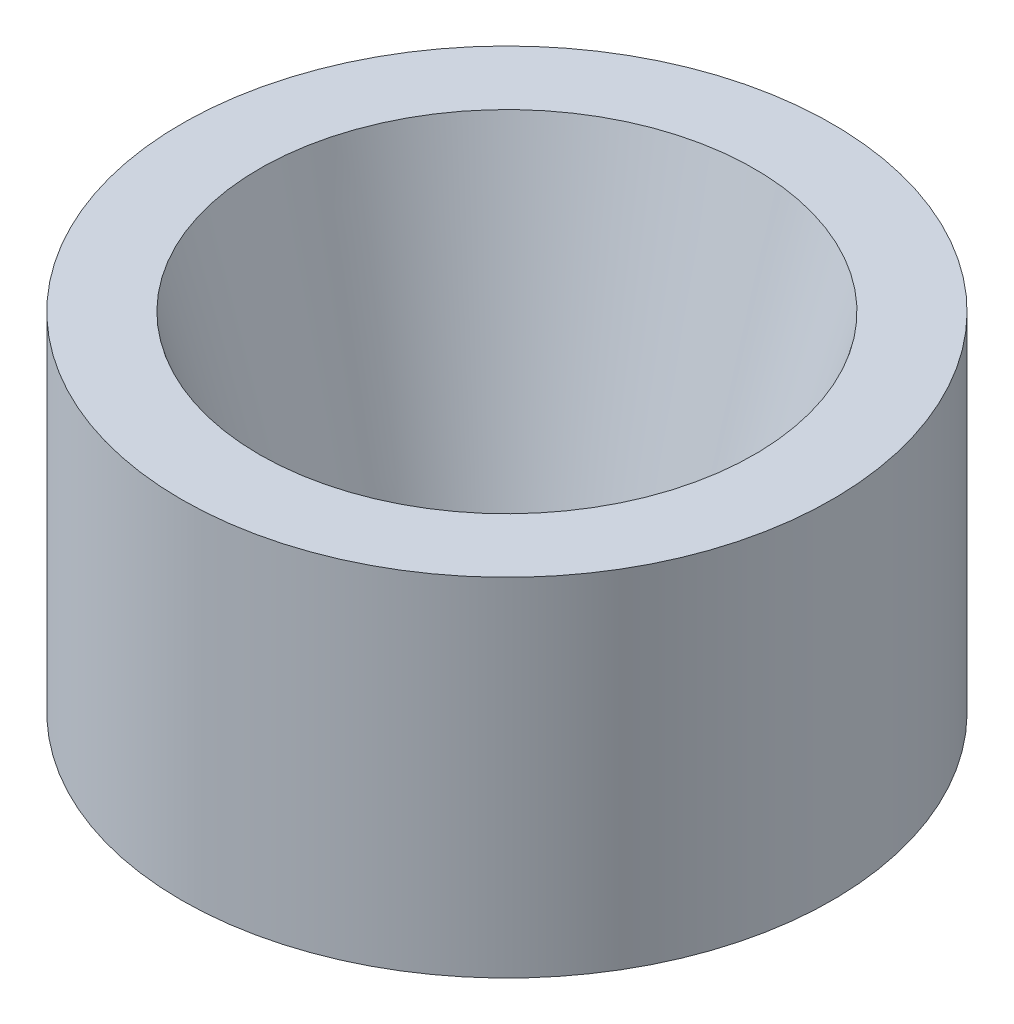
ISO-10303-21;
HEADER;
FILE_DESCRIPTION(('STEP AP214'),'2;1');
FILE_NAME('part.step','',(''),(''),'','','');
FILE_SCHEMA(('AUTOMOTIVE_DESIGN { 1 0 10303 214 1 1 1 1 }'));
ENDSEC;
DATA;
#1=APPLICATION_CONTEXT('core data for automotive mechanical design processes');
#2=APPLICATION_PROTOCOL_DEFINITION('international standard','automotive_design',2000,#1);
#3=PRODUCT_CONTEXT('',#1,'mechanical');
#4=PRODUCT('Part','Part','',(#3));
#5=PRODUCT_RELATED_PRODUCT_CATEGORY('part','',(#4));
#6=PRODUCT_DEFINITION_FORMATION('','',#4);
#7=PRODUCT_DEFINITION_CONTEXT('part definition',#1,'design');
#8=PRODUCT_DEFINITION('design','',#6,#7);
#9=PRODUCT_DEFINITION_SHAPE('','',#8);
#10=(LENGTH_UNIT() NAMED_UNIT(*) SI_UNIT(.MILLI.,.METRE.));
#11=(NAMED_UNIT(*) PLANE_ANGLE_UNIT() SI_UNIT($,.RADIAN.));
#12=(NAMED_UNIT(*) SI_UNIT($,.STERADIAN.) SOLID_ANGLE_UNIT());
#13=UNCERTAINTY_MEASURE_WITH_UNIT(LENGTH_MEASURE(1.E-05),#10,'distance_accuracy_value','');
#14=(GEOMETRIC_REPRESENTATION_CONTEXT(3) GLOBAL_UNCERTAINTY_ASSIGNED_CONTEXT((#13)) GLOBAL_UNIT_ASSIGNED_CONTEXT((#10,
#11,#12)) REPRESENTATION_CONTEXT('',''));
#15=CARTESIAN_POINT('',(0.,0.,0.));
#16=DIRECTION('',(0.,0.,1.));
#17=DIRECTION('',(1.,0.,0.));
#18=AXIS2_PLACEMENT_3D('',#15,#16,#17);
#19=CARTESIAN_POINT('',(-7.5,0.,0.));
#20=DIRECTION('',(0.,1.,0.));
#21=DIRECTION('',(0.,0.,1.));
#22=AXIS2_PLACEMENT_3D('',#19,#20,#21);
#23=PLANE('',#22);
#24=CARTESIAN_POINT('',(0.,0.,0.));
#25=DIRECTION('',(0.,1.,0.));
#26=DIRECTION('',(0.,0.,1.));
#27=AXIS2_PLACEMENT_3D('',#24,#25,#26);
#28=CIRCLE('',#27,7.5);
#29=CARTESIAN_POINT('',(0.,0.,7.5));
#30=VERTEX_POINT('',#29);
#31=EDGE_CURVE('E50',#30,#30,#28,.T.);
#32=ORIENTED_EDGE('',*,*,#31,.T.);
#33=EDGE_LOOP('',(#32));
#34=FACE_BOUND('',#33,.T.);
#35=CARTESIAN_POINT('',(0.,0.,0.));
#36=DIRECTION('',(0.,1.,0.));
#37=DIRECTION('',(0.,0.,1.));
#38=AXIS2_PLACEMENT_3D('',#35,#36,#37);
#39=CIRCLE('',#38,5.70572746839426);
#40=CARTESIAN_POINT('',(0.,0.,5.70572746839426));
#41=VERTEX_POINT('',#40);
#42=EDGE_CURVE('E10',#41,#41,#39,.T.);
#43=ORIENTED_EDGE('',*,*,#42,.F.);
#44=EDGE_LOOP('',(#43));
#45=FACE_BOUND('',#44,.T.);
#46=ADVANCED_FACE('F31',(#34,#45),#23,.T.);
#47=CARTESIAN_POINT('',(0.,-7.10214534595897,0.));
#48=DIRECTION('',(0.,1.,0.));
#49=DIRECTION('',(0.,0.,1.));
#50=AXIS2_PLACEMENT_3D('',#47,#48,#49);
#51=CONICAL_SURFACE('',#50,3.80271335841609,0.26179938779915);
#52=ORIENTED_EDGE('',*,*,#42,.T.);
#53=EDGE_LOOP('',(#52));
#54=FACE_BOUND('',#53,.T.);
#55=CARTESIAN_POINT('',(0.,-7.10214534595897,0.));
#56=DIRECTION('',(0.,1.,0.));
#57=DIRECTION('',(0.,0.,1.));
#58=AXIS2_PLACEMENT_3D('',#55,#56,#57);
#59=CIRCLE('',#58,3.80271335841609);
#60=CARTESIAN_POINT('',(0.,-7.10214534595897,3.80271335841609));
#61=VERTEX_POINT('',#60);
#62=EDGE_CURVE('E37',#61,#61,#59,.T.);
#63=ORIENTED_EDGE('',*,*,#62,.F.);
#64=EDGE_LOOP('',(#63));
#65=FACE_BOUND('',#64,.T.);
#66=ADVANCED_FACE('F68',(#54,#65),#51,.F.);
#67=CARTESIAN_POINT('',(0.,0.,0.));
#68=DIRECTION('',(0.,1.,0.));
#69=DIRECTION('',(0.,0.,1.));
#70=AXIS2_PLACEMENT_3D('',#67,#68,#69);
#71=CYLINDRICAL_SURFACE('',#70,3.80271335841609);
#72=ORIENTED_EDGE('',*,*,#62,.T.);
#73=EDGE_LOOP('',(#72));
#74=FACE_BOUND('',#73,.T.);
#75=CARTESIAN_POINT('',(0.,-8.,0.));
#76=DIRECTION('',(0.,1.,0.));
#77=DIRECTION('',(0.,0.,1.));
#78=AXIS2_PLACEMENT_3D('',#75,#76,#77);
#79=CIRCLE('',#78,3.80271335841609);
#80=CARTESIAN_POINT('',(0.,-8.,3.80271335841609));
#81=VERTEX_POINT('',#80);
#82=EDGE_CURVE('E41',#81,#81,#79,.T.);
#83=ORIENTED_EDGE('',*,*,#82,.F.);
#84=EDGE_LOOP('',(#83));
#85=FACE_BOUND('',#84,.T.);
#86=ADVANCED_FACE('F64',(#74,#85),#71,.F.);
#87=CARTESIAN_POINT('',(-3.80271335841609,-8.,0.));
#88=DIRECTION('',(0.,-1.,0.));
#89=DIRECTION('',(0.,0.,-1.));
#90=AXIS2_PLACEMENT_3D('',#87,#88,#89);
#91=PLANE('',#90);
#92=ORIENTED_EDGE('',*,*,#82,.T.);
#93=EDGE_LOOP('',(#92));
#94=FACE_BOUND('',#93,.T.);
#95=CARTESIAN_POINT('',(0.,-8.,0.));
#96=DIRECTION('',(0.,1.,0.));
#97=DIRECTION('',(0.,0.,1.));
#98=AXIS2_PLACEMENT_3D('',#95,#96,#97);
#99=CIRCLE('',#98,7.5);
#100=CARTESIAN_POINT('',(0.,-8.,7.5));
#101=VERTEX_POINT('',#100);
#102=EDGE_CURVE('E45',#101,#101,#99,.T.);
#103=ORIENTED_EDGE('',*,*,#102,.F.);
#104=EDGE_LOOP('',(#103));
#105=FACE_BOUND('',#104,.T.);
#106=ADVANCED_FACE('F58',(#94,#105),#91,.T.);
#107=CARTESIAN_POINT('',(0.,0.,0.));
#108=DIRECTION('',(0.,1.,0.));
#109=DIRECTION('',(0.,0.,1.));
#110=AXIS2_PLACEMENT_3D('',#107,#108,#109);
#111=CYLINDRICAL_SURFACE('',#110,7.5);
#112=ORIENTED_EDGE('',*,*,#102,.T.);
#113=EDGE_LOOP('',(#112));
#114=FACE_BOUND('',#113,.T.);
#115=ORIENTED_EDGE('',*,*,#31,.F.);
#116=EDGE_LOOP('',(#115));
#117=FACE_BOUND('',#116,.T.);
#118=ADVANCED_FACE('F56',(#114,#117),#111,.T.);
#119=CLOSED_SHELL('',(#46,#66,#86,#106,#118));
#120=MANIFOLD_SOLID_BREP('B2',#119);
#121=ADVANCED_BREP_SHAPE_REPRESENTATION('',(#18,#120),#14);
#122=SHAPE_DEFINITION_REPRESENTATION(#9,#121);
ENDSEC;
END-ISO-10303-21;
